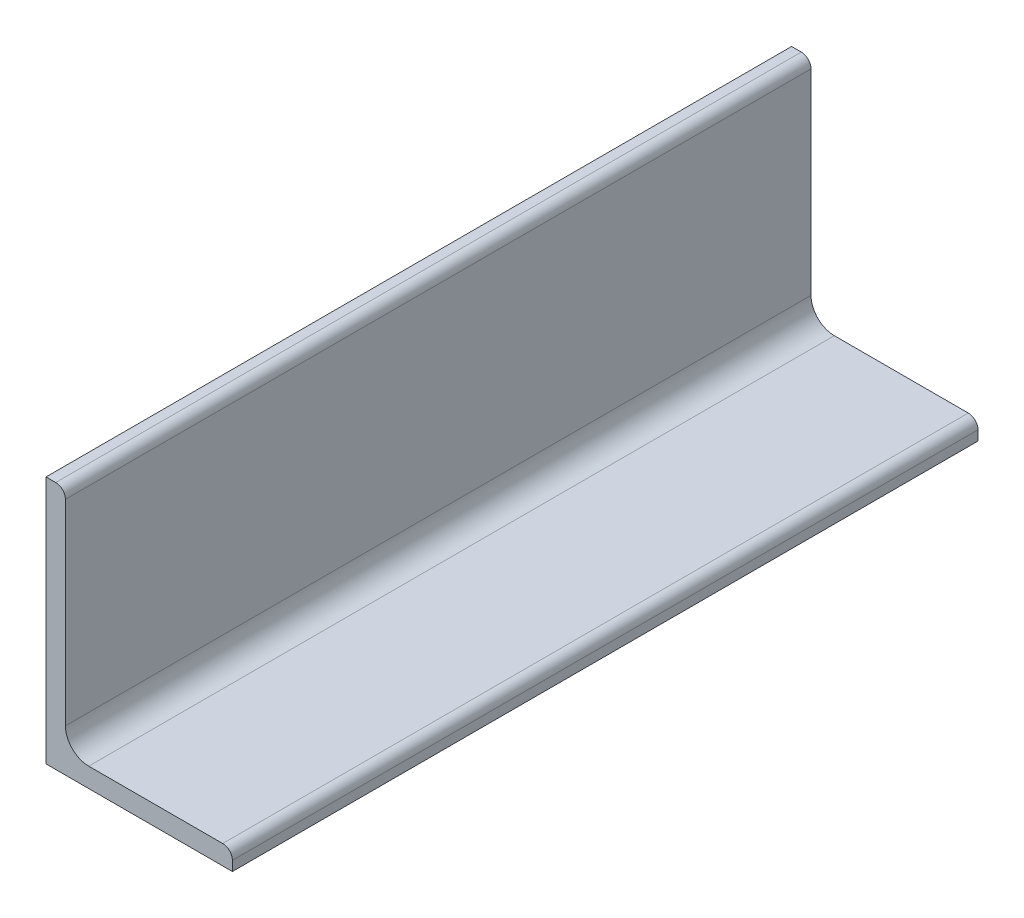
ISO-10303-21;
HEADER;
FILE_DESCRIPTION(('STEP AP214'),'2;1');
FILE_NAME('part.step','',(''),(''),'','','');
FILE_SCHEMA(('AUTOMOTIVE_DESIGN { 1 0 10303 214 1 1 1 1 }'));
ENDSEC;
DATA;
#1=APPLICATION_CONTEXT('core data for automotive mechanical design processes');
#2=APPLICATION_PROTOCOL_DEFINITION('international standard','automotive_design',2000,#1);
#3=PRODUCT_CONTEXT('',#1,'mechanical');
#4=PRODUCT('Part','Part','',(#3));
#5=PRODUCT_RELATED_PRODUCT_CATEGORY('part','',(#4));
#6=PRODUCT_DEFINITION_FORMATION('','',#4);
#7=PRODUCT_DEFINITION_CONTEXT('part definition',#1,'design');
#8=PRODUCT_DEFINITION('design','',#6,#7);
#9=PRODUCT_DEFINITION_SHAPE('','',#8);
#10=(LENGTH_UNIT() NAMED_UNIT(*) SI_UNIT(.MILLI.,.METRE.));
#11=(NAMED_UNIT(*) PLANE_ANGLE_UNIT() SI_UNIT($,.RADIAN.));
#12=(NAMED_UNIT(*) SI_UNIT($,.STERADIAN.) SOLID_ANGLE_UNIT());
#13=UNCERTAINTY_MEASURE_WITH_UNIT(LENGTH_MEASURE(1.E-05),#10,'distance_accuracy_value','');
#14=(GEOMETRIC_REPRESENTATION_CONTEXT(3) GLOBAL_UNCERTAINTY_ASSIGNED_CONTEXT((#13)) GLOBAL_UNIT_ASSIGNED_CONTEXT((#10,
#11,#12)) REPRESENTATION_CONTEXT('',''));
#15=CARTESIAN_POINT('',(0.,0.,0.));
#16=DIRECTION('',(0.,0.,1.));
#17=DIRECTION('',(1.,0.,0.));
#18=AXIS2_PLACEMENT_3D('',#15,#16,#17);
#19=CARTESIAN_POINT('',(0.490776827053332,102.172018782971,304.8));
#20=DIRECTION('',(1.,0.,0.));
#21=DIRECTION('',(0.,0.,-1.));
#22=AXIS2_PLACEMENT_3D('',#19,#20,#21);
#23=PLANE('',#22);
#24=DIRECTION('',(0.,-1.,0.));
#25=VECTOR('',#24,1.);
#26=CARTESIAN_POINT('',(0.490776827053332,102.172018782971,0.));
#27=LINE('',#26,#25);
#28=CARTESIAN_POINT('',(0.490776827053332,102.172018782971,0.));
#29=VERTEX_POINT('',#28);
#30=CARTESIAN_POINT('',(0.490776827053332,0.572018782971054,0.));
#31=VERTEX_POINT('',#30);
#32=EDGE_CURVE('E135',#29,#31,#27,.T.);
#33=ORIENTED_EDGE('',*,*,#32,.T.);
#34=DIRECTION('',(0.,0.,-1.));
#35=VECTOR('',#34,1.);
#36=CARTESIAN_POINT('',(0.490776827053332,0.572018782971054,304.8));
#37=LINE('',#36,#35);
#38=CARTESIAN_POINT('',(0.490776827053332,0.572018782971054,304.8));
#39=VERTEX_POINT('',#38);
#40=EDGE_CURVE('E11',#39,#31,#37,.T.);
#41=ORIENTED_EDGE('',*,*,#40,.F.);
#42=DIRECTION('',(0.,-1.,0.));
#43=VECTOR('',#42,1.);
#44=CARTESIAN_POINT('',(0.490776827053332,102.172018782971,304.8));
#45=LINE('',#44,#43);
#46=CARTESIAN_POINT('',(0.490776827053332,102.172018782971,304.8));
#47=VERTEX_POINT('',#46);
#48=EDGE_CURVE('E151',#47,#39,#45,.T.);
#49=ORIENTED_EDGE('',*,*,#48,.F.);
#50=DIRECTION('',(0.,0.,-1.));
#51=VECTOR('',#50,1.);
#52=CARTESIAN_POINT('',(0.490776827053332,102.172018782971,304.8));
#53=LINE('',#52,#51);
#54=EDGE_CURVE('E131',#47,#29,#53,.T.);
#55=ORIENTED_EDGE('',*,*,#54,.T.);
#56=EDGE_LOOP('',(#33,#41,#49,#55));
#57=FACE_BOUND('',#56,.T.);
#58=ADVANCED_FACE('F33',(#57),#23,.F.);
#59=CARTESIAN_POINT('',(0.490776827053332,0.572018782971054,304.8));
#60=DIRECTION('',(0.,1.,0.));
#61=DIRECTION('',(0.,0.,1.));
#62=AXIS2_PLACEMENT_3D('',#59,#60,#61);
#63=PLANE('',#62);
#64=DIRECTION('',(1.,0.,0.));
#65=VECTOR('',#64,1.);
#66=CARTESIAN_POINT('',(0.490776827053332,0.572018782971054,0.));
#67=LINE('',#66,#65);
#68=CARTESIAN_POINT('',(76.6907768270533,0.572018782971054,0.));
#69=VERTEX_POINT('',#68);
#70=EDGE_CURVE('E138',#31,#69,#67,.T.);
#71=ORIENTED_EDGE('',*,*,#70,.T.);
#72=DIRECTION('',(0.,0.,-1.));
#73=VECTOR('',#72,1.);
#74=CARTESIAN_POINT('',(76.6907768270533,0.572018782971054,304.8));
#75=LINE('',#74,#73);
#76=CARTESIAN_POINT('',(76.6907768270533,0.572018782971054,304.8));
#77=VERTEX_POINT('',#76);
#78=EDGE_CURVE('E41',#77,#69,#75,.T.);
#79=ORIENTED_EDGE('',*,*,#78,.F.);
#80=DIRECTION('',(1.,0.,0.));
#81=VECTOR('',#80,1.);
#82=CARTESIAN_POINT('',(0.490776827053332,0.572018782971054,304.8));
#83=LINE('',#82,#81);
#84=EDGE_CURVE('E95',#39,#77,#83,.T.);
#85=ORIENTED_EDGE('',*,*,#84,.F.);
#86=ORIENTED_EDGE('',*,*,#40,.T.);
#87=EDGE_LOOP('',(#71,#79,#85,#86));
#88=FACE_BOUND('',#87,.T.);
#89=ADVANCED_FACE('F194',(#88),#63,.F.);
#90=CARTESIAN_POINT('',(76.6907768270533,0.572018782971054,304.8));
#91=DIRECTION('',(-1.,0.,0.));
#92=DIRECTION('',(0.,0.,1.));
#93=AXIS2_PLACEMENT_3D('',#90,#91,#92);
#94=PLANE('',#93);
#95=DIRECTION('',(0.,1.,0.));
#96=VECTOR('',#95,1.);
#97=CARTESIAN_POINT('',(76.6907768270533,0.572018782971054,0.));
#98=LINE('',#97,#96);
#99=CARTESIAN_POINT('',(76.6907768270533,4.54076878297105,0.));
#100=VERTEX_POINT('',#99);
#101=EDGE_CURVE('E140',#69,#100,#98,.T.);
#102=ORIENTED_EDGE('',*,*,#101,.T.);
#103=DIRECTION('',(0.,0.,-1.));
#104=VECTOR('',#103,1.);
#105=CARTESIAN_POINT('',(76.6907768270533,4.54076878297105,304.8));
#106=LINE('',#105,#104);
#107=CARTESIAN_POINT('',(76.6907768270533,4.54076878297105,304.8));
#108=VERTEX_POINT('',#107);
#109=EDGE_CURVE('E161',#108,#100,#106,.T.);
#110=ORIENTED_EDGE('',*,*,#109,.F.);
#111=DIRECTION('',(0.,1.,0.));
#112=VECTOR('',#111,1.);
#113=CARTESIAN_POINT('',(76.6907768270533,0.572018782971054,304.8));
#114=LINE('',#113,#112);
#115=EDGE_CURVE('E169',#77,#108,#114,.T.);
#116=ORIENTED_EDGE('',*,*,#115,.F.);
#117=ORIENTED_EDGE('',*,*,#78,.T.);
#118=EDGE_LOOP('',(#102,#110,#116,#117));
#119=FACE_BOUND('',#118,.T.);
#120=ADVANCED_FACE('F167',(#119),#94,.F.);
#121=CARTESIAN_POINT('',(72.7220268270533,4.54076878297105,304.8));
#122=DIRECTION('',(0.,0.,-1.));
#123=DIRECTION('',(-1.,0.,0.));
#124=AXIS2_PLACEMENT_3D('',#121,#122,#123);
#125=CYLINDRICAL_SURFACE('',#124,3.96875);
#126=CARTESIAN_POINT('',(72.7220268270533,4.54076878297105,0.));
#127=DIRECTION('',(0.,0.,1.));
#128=DIRECTION('',(1.,0.,0.));
#129=AXIS2_PLACEMENT_3D('',#126,#127,#128);
#130=CIRCLE('',#129,3.96875);
#131=CARTESIAN_POINT('',(72.7220268270533,8.50951878297106,0.));
#132=VERTEX_POINT('',#131);
#133=EDGE_CURVE('E142',#100,#132,#130,.T.);
#134=ORIENTED_EDGE('',*,*,#133,.T.);
#135=DIRECTION('',(0.,0.,-1.));
#136=VECTOR('',#135,1.);
#137=CARTESIAN_POINT('',(72.7220268270533,8.50951878297106,304.8));
#138=LINE('',#137,#136);
#139=CARTESIAN_POINT('',(72.7220268270533,8.50951878297106,304.8));
#140=VERTEX_POINT('',#139);
#141=EDGE_CURVE('E158',#140,#132,#138,.T.);
#142=ORIENTED_EDGE('',*,*,#141,.F.);
#143=CARTESIAN_POINT('',(72.7220268270533,4.54076878297105,304.8));
#144=DIRECTION('',(0.,0.,1.));
#145=DIRECTION('',(1.,0.,0.));
#146=AXIS2_PLACEMENT_3D('',#143,#144,#145);
#147=CIRCLE('',#146,3.96875);
#148=EDGE_CURVE('E185',#108,#140,#147,.T.);
#149=ORIENTED_EDGE('',*,*,#148,.F.);
#150=ORIENTED_EDGE('',*,*,#109,.T.);
#151=EDGE_LOOP('',(#134,#142,#149,#150));
#152=FACE_BOUND('',#151,.T.);
#153=ADVANCED_FACE('F178',(#152),#125,.T.);
#154=CARTESIAN_POINT('',(72.7220268270533,8.50951878297105,304.8));
#155=DIRECTION('',(0.,-1.,0.));
#156=DIRECTION('',(0.,0.,-1.));
#157=AXIS2_PLACEMENT_3D('',#154,#155,#156);
#158=PLANE('',#157);
#159=DIRECTION('',(-1.,0.,0.));
#160=VECTOR('',#159,1.);
#161=CARTESIAN_POINT('',(72.7220268270533,8.50951878297105,0.));
#162=LINE('',#161,#160);
#163=CARTESIAN_POINT('',(17.9532768270533,8.50951878297105,0.));
#164=VERTEX_POINT('',#163);
#165=EDGE_CURVE('E144',#132,#164,#162,.T.);
#166=ORIENTED_EDGE('',*,*,#165,.T.);
#167=DIRECTION('',(0.,0.,-1.));
#168=VECTOR('',#167,1.);
#169=CARTESIAN_POINT('',(17.9532768270533,8.50951878297105,304.8));
#170=LINE('',#169,#168);
#171=CARTESIAN_POINT('',(17.9532768270533,8.50951878297105,304.8));
#172=VERTEX_POINT('',#171);
#173=EDGE_CURVE('E155',#172,#164,#170,.T.);
#174=ORIENTED_EDGE('',*,*,#173,.F.);
#175=DIRECTION('',(-1.,0.,0.));
#176=VECTOR('',#175,1.);
#177=CARTESIAN_POINT('',(72.7220268270533,8.50951878297105,304.8));
#178=LINE('',#177,#176);
#179=EDGE_CURVE('E184',#140,#172,#178,.T.);
#180=ORIENTED_EDGE('',*,*,#179,.F.);
#181=ORIENTED_EDGE('',*,*,#141,.T.);
#182=EDGE_LOOP('',(#166,#174,#180,#181));
#183=FACE_BOUND('',#182,.T.);
#184=ADVANCED_FACE('F182',(#183),#158,.F.);
#185=CARTESIAN_POINT('',(17.9532768270533,18.034518782971,304.8));
#186=DIRECTION('',(0.,0.,-1.));
#187=DIRECTION('',(-1.,0.,0.));
#188=AXIS2_PLACEMENT_3D('',#185,#186,#187);
#189=CYLINDRICAL_SURFACE('',#188,9.52499999999999);
#190=CARTESIAN_POINT('',(17.9532768270533,18.034518782971,0.));
#191=DIRECTION('',(0.,0.,-1.));
#192=DIRECTION('',(1.,0.,0.));
#193=AXIS2_PLACEMENT_3D('',#190,#191,#192);
#194=CIRCLE('',#193,9.52499999999999);
#195=CARTESIAN_POINT('',(8.42827682705333,18.0345187829711,0.));
#196=VERTEX_POINT('',#195);
#197=EDGE_CURVE('E146',#164,#196,#194,.T.);
#198=ORIENTED_EDGE('',*,*,#197,.T.);
#199=DIRECTION('',(0.,0.,-1.));
#200=VECTOR('',#199,1.);
#201=CARTESIAN_POINT('',(8.42827682705333,18.0345187829711,304.8));
#202=LINE('',#201,#200);
#203=CARTESIAN_POINT('',(8.42827682705333,18.0345187829711,304.8));
#204=VERTEX_POINT('',#203);
#205=EDGE_CURVE('E126',#204,#196,#202,.T.);
#206=ORIENTED_EDGE('',*,*,#205,.F.);
#207=CARTESIAN_POINT('',(17.9532768270533,18.034518782971,304.8));
#208=DIRECTION('',(0.,0.,-1.));
#209=DIRECTION('',(1.,0.,0.));
#210=AXIS2_PLACEMENT_3D('',#207,#208,#209);
#211=CIRCLE('',#210,9.52499999999999);
#212=EDGE_CURVE('E117',#172,#204,#211,.T.);
#213=ORIENTED_EDGE('',*,*,#212,.F.);
#214=ORIENTED_EDGE('',*,*,#173,.T.);
#215=EDGE_LOOP('',(#198,#206,#213,#214));
#216=FACE_BOUND('',#215,.T.);
#217=ADVANCED_FACE('F206',(#216),#189,.F.);
#218=CARTESIAN_POINT('',(8.42827682705333,18.0345187829711,304.8));
#219=DIRECTION('',(-1.,0.,0.));
#220=DIRECTION('',(0.,0.,1.));
#221=AXIS2_PLACEMENT_3D('',#218,#219,#220);
#222=PLANE('',#221);
#223=DIRECTION('',(0.,1.,0.));
#224=VECTOR('',#223,1.);
#225=CARTESIAN_POINT('',(8.42827682705333,18.0345187829711,0.));
#226=LINE('',#225,#224);
#227=CARTESIAN_POINT('',(8.42827682705333,98.2032687829711,0.));
#228=VERTEX_POINT('',#227);
#229=EDGE_CURVE('E125',#196,#228,#226,.T.);
#230=ORIENTED_EDGE('',*,*,#229,.T.);
#231=DIRECTION('',(0.,0.,-1.));
#232=VECTOR('',#231,1.);
#233=CARTESIAN_POINT('',(8.42827682705333,98.2032687829711,304.8));
#234=LINE('',#233,#232);
#235=CARTESIAN_POINT('',(8.42827682705333,98.2032687829711,304.8));
#236=VERTEX_POINT('',#235);
#237=EDGE_CURVE('E122',#236,#228,#234,.T.);
#238=ORIENTED_EDGE('',*,*,#237,.F.);
#239=DIRECTION('',(0.,1.,0.));
#240=VECTOR('',#239,1.);
#241=CARTESIAN_POINT('',(8.42827682705333,18.0345187829711,304.8));
#242=LINE('',#241,#240);
#243=EDGE_CURVE('E111',#204,#236,#242,.T.);
#244=ORIENTED_EDGE('',*,*,#243,.F.);
#245=ORIENTED_EDGE('',*,*,#205,.T.);
#246=EDGE_LOOP('',(#230,#238,#244,#245));
#247=FACE_BOUND('',#246,.T.);
#248=ADVANCED_FACE('F123',(#247),#222,.F.);
#249=CARTESIAN_POINT('',(4.45952682705334,98.203268782971,304.8));
#250=DIRECTION('',(0.,0.,-1.));
#251=DIRECTION('',(-1.,0.,0.));
#252=AXIS2_PLACEMENT_3D('',#249,#250,#251);
#253=CYLINDRICAL_SURFACE('',#252,3.96875);
#254=CARTESIAN_POINT('',(4.45952682705334,98.203268782971,0.));
#255=DIRECTION('',(0.,0.,1.));
#256=DIRECTION('',(1.,0.,0.));
#257=AXIS2_PLACEMENT_3D('',#254,#255,#256);
#258=CIRCLE('',#257,3.96875);
#259=CARTESIAN_POINT('',(4.45952682705333,102.172018782971,0.));
#260=VERTEX_POINT('',#259);
#261=EDGE_CURVE('E81',#228,#260,#258,.T.);
#262=ORIENTED_EDGE('',*,*,#261,.T.);
#263=DIRECTION('',(0.,0.,-1.));
#264=VECTOR('',#263,1.);
#265=CARTESIAN_POINT('',(4.45952682705333,102.172018782971,304.8));
#266=LINE('',#265,#264);
#267=CARTESIAN_POINT('',(4.45952682705333,102.172018782971,304.8));
#268=VERTEX_POINT('',#267);
#269=EDGE_CURVE('E127',#268,#260,#266,.T.);
#270=ORIENTED_EDGE('',*,*,#269,.F.);
#271=CARTESIAN_POINT('',(4.45952682705334,98.203268782971,304.8));
#272=DIRECTION('',(0.,0.,1.));
#273=DIRECTION('',(1.,0.,0.));
#274=AXIS2_PLACEMENT_3D('',#271,#272,#273);
#275=CIRCLE('',#274,3.96875);
#276=EDGE_CURVE('E115',#236,#268,#275,.T.);
#277=ORIENTED_EDGE('',*,*,#276,.F.);
#278=ORIENTED_EDGE('',*,*,#237,.T.);
#279=EDGE_LOOP('',(#262,#270,#277,#278));
#280=FACE_BOUND('',#279,.T.);
#281=ADVANCED_FACE('F129',(#280),#253,.T.);
#282=CARTESIAN_POINT('',(4.45952682705333,102.172018782971,304.8));
#283=DIRECTION('',(0.,-1.,0.));
#284=DIRECTION('',(0.,0.,-1.));
#285=AXIS2_PLACEMENT_3D('',#282,#283,#284);
#286=PLANE('',#285);
#287=DIRECTION('',(-1.,0.,0.));
#288=VECTOR('',#287,1.);
#289=CARTESIAN_POINT('',(4.45952682705333,102.172018782971,0.));
#290=LINE('',#289,#288);
#291=EDGE_CURVE('E87',#260,#29,#290,.T.);
#292=ORIENTED_EDGE('',*,*,#291,.T.);
#293=ORIENTED_EDGE('',*,*,#54,.F.);
#294=DIRECTION('',(-1.,0.,0.));
#295=VECTOR('',#294,1.);
#296=CARTESIAN_POINT('',(4.45952682705333,102.172018782971,304.8));
#297=LINE('',#296,#295);
#298=EDGE_CURVE('E49',#268,#47,#297,.T.);
#299=ORIENTED_EDGE('',*,*,#298,.F.);
#300=ORIENTED_EDGE('',*,*,#269,.T.);
#301=EDGE_LOOP('',(#292,#293,#299,#300));
#302=FACE_BOUND('',#301,.T.);
#303=ADVANCED_FACE('F214',(#302),#286,.F.);
#304=CARTESIAN_POINT('',(72.7220268270533,4.54076878297105,304.8));
#305=DIRECTION('',(0.,0.,1.));
#306=DIRECTION('',(1.,0.,0.));
#307=AXIS2_PLACEMENT_3D('',#304,#305,#306);
#308=PLANE('',#307);
#309=ORIENTED_EDGE('',*,*,#48,.T.);
#310=ORIENTED_EDGE('',*,*,#84,.T.);
#311=ORIENTED_EDGE('',*,*,#115,.T.);
#312=ORIENTED_EDGE('',*,*,#148,.T.);
#313=ORIENTED_EDGE('',*,*,#179,.T.);
#314=ORIENTED_EDGE('',*,*,#212,.T.);
#315=ORIENTED_EDGE('',*,*,#243,.T.);
#316=ORIENTED_EDGE('',*,*,#276,.T.);
#317=ORIENTED_EDGE('',*,*,#298,.T.);
#318=EDGE_LOOP('',(#309,#310,#311,#312,#313,#314,#315,#316,#317));
#319=FACE_BOUND('',#318,.T.);
#320=ADVANCED_FACE('F113',(#319),#308,.T.);
#321=CARTESIAN_POINT('',(72.7220268270533,4.54076878297105,0.));
#322=DIRECTION('',(0.,0.,1.));
#323=DIRECTION('',(1.,0.,0.));
#324=AXIS2_PLACEMENT_3D('',#321,#322,#323);
#325=PLANE('',#324);
#326=ORIENTED_EDGE('',*,*,#32,.F.);
#327=ORIENTED_EDGE('',*,*,#291,.F.);
#328=ORIENTED_EDGE('',*,*,#261,.F.);
#329=ORIENTED_EDGE('',*,*,#229,.F.);
#330=ORIENTED_EDGE('',*,*,#197,.F.);
#331=ORIENTED_EDGE('',*,*,#165,.F.);
#332=ORIENTED_EDGE('',*,*,#133,.F.);
#333=ORIENTED_EDGE('',*,*,#101,.F.);
#334=ORIENTED_EDGE('',*,*,#70,.F.);
#335=EDGE_LOOP('',(#326,#327,#328,#329,#330,#331,#332,#333,#334));
#336=FACE_BOUND('',#335,.T.);
#337=ADVANCED_FACE('F173',(#336),#325,.F.);
#338=CLOSED_SHELL('',(#58,#89,#120,#153,#184,#217,#248,#281,#303,#320,#337));
#339=MANIFOLD_SOLID_BREP('B2',#338);
#340=ADVANCED_BREP_SHAPE_REPRESENTATION('',(#18,#339),#14);
#341=SHAPE_DEFINITION_REPRESENTATION(#9,#340);
ENDSEC;
END-ISO-10303-21;
